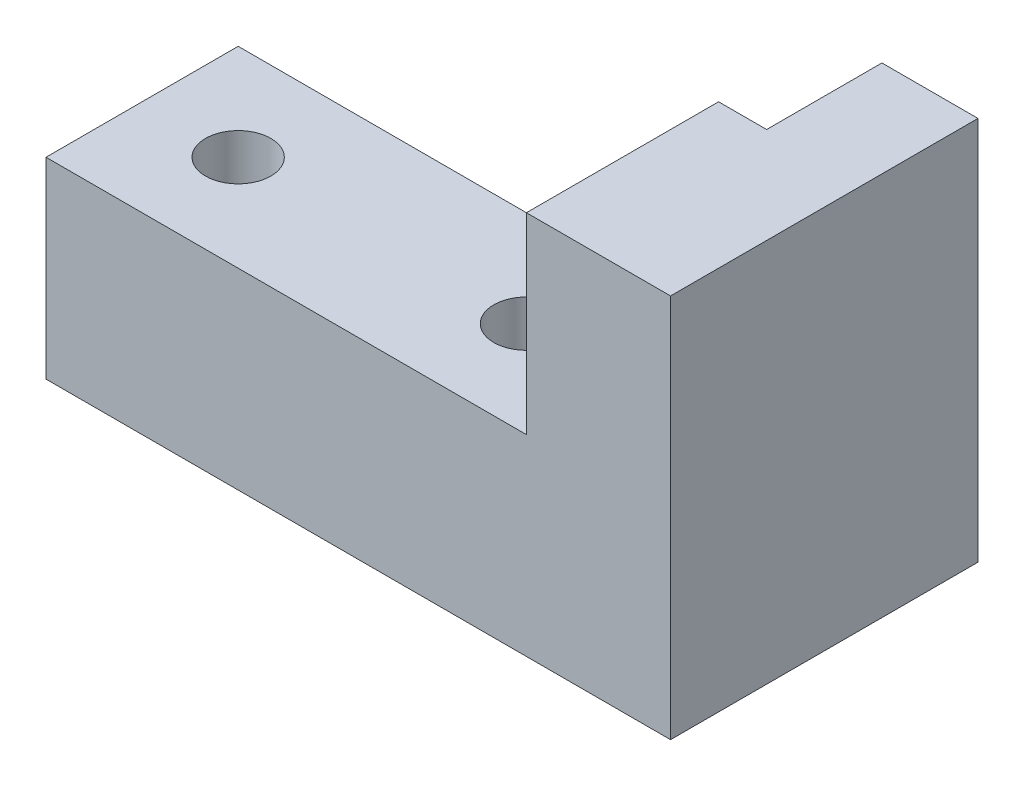
ISO-10303-21;
HEADER;
FILE_DESCRIPTION(('STEP AP214'),'2;1');
FILE_NAME('part.step','',(''),(''),'','','');
FILE_SCHEMA(('AUTOMOTIVE_DESIGN { 1 0 10303 214 1 1 1 1 }'));
ENDSEC;
DATA;
#1=APPLICATION_CONTEXT('core data for automotive mechanical design processes');
#2=APPLICATION_PROTOCOL_DEFINITION('international standard','automotive_design',2000,#1);
#3=PRODUCT_CONTEXT('',#1,'mechanical');
#4=PRODUCT('Part','Part','',(#3));
#5=PRODUCT_RELATED_PRODUCT_CATEGORY('part','',(#4));
#6=PRODUCT_DEFINITION_FORMATION('','',#4);
#7=PRODUCT_DEFINITION_CONTEXT('part definition',#1,'design');
#8=PRODUCT_DEFINITION('design','',#6,#7);
#9=PRODUCT_DEFINITION_SHAPE('','',#8);
#10=(LENGTH_UNIT() NAMED_UNIT(*) SI_UNIT(.MILLI.,.METRE.));
#11=(NAMED_UNIT(*) PLANE_ANGLE_UNIT() SI_UNIT($,.RADIAN.));
#12=(NAMED_UNIT(*) SI_UNIT($,.STERADIAN.) SOLID_ANGLE_UNIT());
#13=UNCERTAINTY_MEASURE_WITH_UNIT(LENGTH_MEASURE(1.E-05),#10,'distance_accuracy_value','');
#14=(GEOMETRIC_REPRESENTATION_CONTEXT(3) GLOBAL_UNCERTAINTY_ASSIGNED_CONTEXT((#13)) GLOBAL_UNIT_ASSIGNED_CONTEXT((#10,
#11,#12)) REPRESENTATION_CONTEXT('',''));
#15=CARTESIAN_POINT('',(0.,0.,0.));
#16=DIRECTION('',(0.,0.,1.));
#17=DIRECTION('',(1.,0.,0.));
#18=AXIS2_PLACEMENT_3D('',#15,#16,#17);
#19=CARTESIAN_POINT('',(0.,10.,0.));
#20=DIRECTION('',(0.,1.,0.));
#21=DIRECTION('',(0.,0.,1.));
#22=AXIS2_PLACEMENT_3D('',#19,#20,#21);
#23=PLANE('',#22);
#24=CARTESIAN_POINT('',(-7.5,10.,0.));
#25=DIRECTION('',(0.,1.,0.));
#26=DIRECTION('',(0.,0.,1.));
#27=AXIS2_PLACEMENT_3D('',#24,#25,#26);
#28=CIRCLE('',#27,1.7);
#29=CARTESIAN_POINT('',(-7.5,10.,1.7));
#30=VERTEX_POINT('',#29);
#31=EDGE_CURVE('E96',#30,#30,#28,.T.);
#32=ORIENTED_EDGE('',*,*,#31,.F.);
#33=EDGE_LOOP('',(#32));
#34=FACE_BOUND('',#33,.T.);
#35=DIRECTION('',(0.,0.,1.));
#36=VECTOR('',#35,1.);
#37=CARTESIAN_POINT('',(-12.5,10.,-5.));
#38=LINE('',#37,#36);
#39=CARTESIAN_POINT('',(-12.5,10.,-5.));
#40=VERTEX_POINT('',#39);
#41=CARTESIAN_POINT('',(-12.5,10.,5.));
#42=VERTEX_POINT('',#41);
#43=EDGE_CURVE('E86',#40,#42,#38,.T.);
#44=ORIENTED_EDGE('',*,*,#43,.T.);
#45=DIRECTION('',(1.,0.,0.));
#46=VECTOR('',#45,1.);
#47=CARTESIAN_POINT('',(-12.5,10.,5.));
#48=LINE('',#47,#46);
#49=CARTESIAN_POINT('',(12.5,10.,4.99999999999999));
#50=VERTEX_POINT('',#49);
#51=EDGE_CURVE('E80',#42,#50,#48,.T.);
#52=ORIENTED_EDGE('',*,*,#51,.T.);
#53=DIRECTION('',(0.,0.,-1.));
#54=VECTOR('',#53,1.);
#55=CARTESIAN_POINT('',(12.5,10.,-5.));
#56=LINE('',#55,#54);
#57=CARTESIAN_POINT('',(12.5,10.,-5.));
#58=VERTEX_POINT('',#57);
#59=EDGE_CURVE('E69',#50,#58,#56,.T.);
#60=ORIENTED_EDGE('',*,*,#59,.T.);
#61=DIRECTION('',(-1.,0.,0.));
#62=VECTOR('',#61,1.);
#63=CARTESIAN_POINT('',(-12.5,10.,-5.));
#64=LINE('',#63,#62);
#65=EDGE_CURVE('E49',#58,#40,#64,.T.);
#66=ORIENTED_EDGE('',*,*,#65,.T.);
#67=EDGE_LOOP('',(#44,#52,#60,#66));
#68=FACE_BOUND('',#67,.T.);
#69=CARTESIAN_POINT('',(7.5,10.,0.));
#70=DIRECTION('',(0.,1.,0.));
#71=DIRECTION('',(0.,0.,1.));
#72=AXIS2_PLACEMENT_3D('',#69,#70,#71);
#73=CIRCLE('',#72,1.7);
#74=CARTESIAN_POINT('',(7.5,10.,1.7));
#75=VERTEX_POINT('',#74);
#76=EDGE_CURVE('E107',#75,#75,#73,.T.);
#77=ORIENTED_EDGE('',*,*,#76,.F.);
#78=EDGE_LOOP('',(#77));
#79=FACE_BOUND('',#78,.T.);
#80=ADVANCED_FACE('F32',(#34,#68,#79),#23,.T.);
#81=CARTESIAN_POINT('',(0.,0.,0.));
#82=DIRECTION('',(0.,1.,0.));
#83=DIRECTION('',(0.,0.,1.));
#84=AXIS2_PLACEMENT_3D('',#81,#82,#83);
#85=PLANE('',#84);
#86=DIRECTION('',(0.,0.,1.));
#87=VECTOR('',#86,1.);
#88=CARTESIAN_POINT('',(-12.5,0.,-5.));
#89=LINE('',#88,#87);
#90=CARTESIAN_POINT('',(-12.5,0.,-5.));
#91=VERTEX_POINT('',#90);
#92=CARTESIAN_POINT('',(-12.5,0.,5.));
#93=VERTEX_POINT('',#92);
#94=EDGE_CURVE('E94',#91,#93,#89,.T.);
#95=ORIENTED_EDGE('',*,*,#94,.F.);
#96=DIRECTION('',(-1.,0.,0.));
#97=VECTOR('',#96,1.);
#98=CARTESIAN_POINT('',(-12.5,0.,-5.));
#99=LINE('',#98,#97);
#100=CARTESIAN_POINT('',(15.,0.,-5.));
#101=VERTEX_POINT('',#100);
#102=EDGE_CURVE('E92',#101,#91,#99,.T.);
#103=ORIENTED_EDGE('',*,*,#102,.F.);
#104=DIRECTION('',(0.,0.,1.));
#105=VECTOR('',#104,1.);
#106=CARTESIAN_POINT('',(15.,0.,-5.));
#107=LINE('',#106,#105);
#108=CARTESIAN_POINT('',(15.,0.,-11.));
#109=VERTEX_POINT('',#108);
#110=EDGE_CURVE('E130',#109,#101,#107,.T.);
#111=ORIENTED_EDGE('',*,*,#110,.F.);
#112=DIRECTION('',(-1.,0.,0.));
#113=VECTOR('',#112,1.);
#114=CARTESIAN_POINT('',(20.,0.,-11.));
#115=LINE('',#114,#113);
#116=CARTESIAN_POINT('',(20.,0.,-11.));
#117=VERTEX_POINT('',#116);
#118=EDGE_CURVE('E134',#117,#109,#115,.T.);
#119=ORIENTED_EDGE('',*,*,#118,.F.);
#120=DIRECTION('',(0.,0.,-1.));
#121=VECTOR('',#120,1.);
#122=CARTESIAN_POINT('',(20.,0.,4.99999999999999));
#123=LINE('',#122,#121);
#124=CARTESIAN_POINT('',(20.,0.,4.99999999999999));
#125=VERTEX_POINT('',#124);
#126=EDGE_CURVE('E137',#125,#117,#123,.T.);
#127=ORIENTED_EDGE('',*,*,#126,.F.);
#128=DIRECTION('',(1.,0.,0.));
#129=VECTOR('',#128,1.);
#130=CARTESIAN_POINT('',(-12.5,0.,5.));
#131=LINE('',#130,#129);
#132=EDGE_CURVE('E62',#93,#125,#131,.T.);
#133=ORIENTED_EDGE('',*,*,#132,.F.);
#134=EDGE_LOOP('',(#95,#103,#111,#119,#127,#133));
#135=FACE_BOUND('',#134,.T.);
#136=CARTESIAN_POINT('',(-7.5,0.,0.));
#137=DIRECTION('',(0.,1.,0.));
#138=DIRECTION('',(0.,0.,1.));
#139=AXIS2_PLACEMENT_3D('',#136,#137,#138);
#140=CIRCLE('',#139,1.7);
#141=CARTESIAN_POINT('',(-7.5,0.,1.7));
#142=VERTEX_POINT('',#141);
#143=EDGE_CURVE('E100',#142,#142,#140,.T.);
#144=ORIENTED_EDGE('',*,*,#143,.T.);
#145=EDGE_LOOP('',(#144));
#146=FACE_BOUND('',#145,.T.);
#147=CARTESIAN_POINT('',(7.5,0.,0.));
#148=DIRECTION('',(0.,1.,0.));
#149=DIRECTION('',(0.,0.,1.));
#150=AXIS2_PLACEMENT_3D('',#147,#148,#149);
#151=CIRCLE('',#150,1.7);
#152=CARTESIAN_POINT('',(7.5,0.,1.7));
#153=VERTEX_POINT('',#152);
#154=EDGE_CURVE('E109',#153,#153,#151,.T.);
#155=ORIENTED_EDGE('',*,*,#154,.T.);
#156=EDGE_LOOP('',(#155));
#157=FACE_BOUND('',#156,.T.);
#158=ADVANCED_FACE('F179',(#135,#146,#157),#85,.F.);
#159=CARTESIAN_POINT('',(-12.5,10.,-5.));
#160=DIRECTION('',(1.,0.,0.));
#161=DIRECTION('',(0.,0.,-1.));
#162=AXIS2_PLACEMENT_3D('',#159,#160,#161);
#163=PLANE('',#162);
#164=ORIENTED_EDGE('',*,*,#94,.T.);
#165=DIRECTION('',(0.,-1.,0.));
#166=VECTOR('',#165,1.);
#167=CARTESIAN_POINT('',(-12.5,10.,5.));
#168=LINE('',#167,#166);
#169=EDGE_CURVE('E11',#42,#93,#168,.T.);
#170=ORIENTED_EDGE('',*,*,#169,.F.);
#171=ORIENTED_EDGE('',*,*,#43,.F.);
#172=DIRECTION('',(0.,-1.,0.));
#173=VECTOR('',#172,1.);
#174=CARTESIAN_POINT('',(-12.5,10.,-5.));
#175=LINE('',#174,#173);
#176=EDGE_CURVE('E41',#40,#91,#175,.T.);
#177=ORIENTED_EDGE('',*,*,#176,.T.);
#178=EDGE_LOOP('',(#164,#170,#171,#177));
#179=FACE_BOUND('',#178,.T.);
#180=ADVANCED_FACE('F34',(#179),#163,.F.);
#181=CARTESIAN_POINT('',(-12.5,10.,5.));
#182=DIRECTION('',(0.,0.,-1.));
#183=DIRECTION('',(-1.,0.,0.));
#184=AXIS2_PLACEMENT_3D('',#181,#182,#183);
#185=PLANE('',#184);
#186=ORIENTED_EDGE('',*,*,#132,.T.);
#187=DIRECTION('',(0.,-1.,0.));
#188=VECTOR('',#187,1.);
#189=CARTESIAN_POINT('',(20.,20.,4.99999999999999));
#190=LINE('',#189,#188);
#191=CARTESIAN_POINT('',(20.,20.,4.99999999999999));
#192=VERTEX_POINT('',#191);
#193=EDGE_CURVE('E115',#192,#125,#190,.T.);
#194=ORIENTED_EDGE('',*,*,#193,.F.);
#195=DIRECTION('',(1.,0.,0.));
#196=VECTOR('',#195,1.);
#197=CARTESIAN_POINT('',(12.5,20.,4.99999999999999));
#198=LINE('',#197,#196);
#199=CARTESIAN_POINT('',(12.5,20.,4.99999999999999));
#200=VERTEX_POINT('',#199);
#201=EDGE_CURVE('E150',#200,#192,#198,.T.);
#202=ORIENTED_EDGE('',*,*,#201,.F.);
#203=DIRECTION('',(0.,-1.,0.));
#204=VECTOR('',#203,1.);
#205=CARTESIAN_POINT('',(12.5,20.,4.99999999999999));
#206=LINE('',#205,#204);
#207=EDGE_CURVE('E85',#200,#50,#206,.T.);
#208=ORIENTED_EDGE('',*,*,#207,.T.);
#209=ORIENTED_EDGE('',*,*,#51,.F.);
#210=ORIENTED_EDGE('',*,*,#169,.T.);
#211=EDGE_LOOP('',(#186,#194,#202,#208,#209,#210));
#212=FACE_BOUND('',#211,.T.);
#213=ADVANCED_FACE('F81',(#212),#185,.F.);
#214=CARTESIAN_POINT('',(-12.5,10.,-5.));
#215=DIRECTION('',(0.,0.,1.));
#216=DIRECTION('',(1.,0.,0.));
#217=AXIS2_PLACEMENT_3D('',#214,#215,#216);
#218=PLANE('',#217);
#219=ORIENTED_EDGE('',*,*,#102,.T.);
#220=ORIENTED_EDGE('',*,*,#176,.F.);
#221=ORIENTED_EDGE('',*,*,#65,.F.);
#222=DIRECTION('',(0.,-1.,0.));
#223=VECTOR('',#222,1.);
#224=CARTESIAN_POINT('',(12.5,20.,-5.));
#225=LINE('',#224,#223);
#226=CARTESIAN_POINT('',(12.5,20.,-5.));
#227=VERTEX_POINT('',#226);
#228=EDGE_CURVE('E127',#227,#58,#225,.T.);
#229=ORIENTED_EDGE('',*,*,#228,.F.);
#230=DIRECTION('',(-1.,0.,0.));
#231=VECTOR('',#230,1.);
#232=CARTESIAN_POINT('',(12.5,20.,-5.));
#233=LINE('',#232,#231);
#234=CARTESIAN_POINT('',(15.,20.,-5.));
#235=VERTEX_POINT('',#234);
#236=EDGE_CURVE('E129',#235,#227,#233,.T.);
#237=ORIENTED_EDGE('',*,*,#236,.F.);
#238=DIRECTION('',(0.,-1.,0.));
#239=VECTOR('',#238,1.);
#240=CARTESIAN_POINT('',(15.,20.,-5.));
#241=LINE('',#240,#239);
#242=EDGE_CURVE('E124',#235,#101,#241,.T.);
#243=ORIENTED_EDGE('',*,*,#242,.T.);
#244=EDGE_LOOP('',(#219,#220,#221,#229,#237,#243));
#245=FACE_BOUND('',#244,.T.);
#246=ADVANCED_FACE('F189',(#245),#218,.F.);
#247=CARTESIAN_POINT('',(-7.5,10.,0.));
#248=DIRECTION('',(0.,-1.,0.));
#249=DIRECTION('',(0.,0.,-1.));
#250=AXIS2_PLACEMENT_3D('',#247,#248,#249);
#251=CYLINDRICAL_SURFACE('',#250,1.7);
#252=ORIENTED_EDGE('',*,*,#31,.T.);
#253=EDGE_LOOP('',(#252));
#254=FACE_BOUND('',#253,.T.);
#255=ORIENTED_EDGE('',*,*,#143,.F.);
#256=EDGE_LOOP('',(#255));
#257=FACE_BOUND('',#256,.T.);
#258=ADVANCED_FACE('F175',(#254,#257),#251,.F.);
#259=CARTESIAN_POINT('',(7.5,10.,0.));
#260=DIRECTION('',(0.,-1.,0.));
#261=DIRECTION('',(0.,0.,-1.));
#262=AXIS2_PLACEMENT_3D('',#259,#260,#261);
#263=CYLINDRICAL_SURFACE('',#262,1.7);
#264=ORIENTED_EDGE('',*,*,#76,.T.);
#265=EDGE_LOOP('',(#264));
#266=FACE_BOUND('',#265,.T.);
#267=ORIENTED_EDGE('',*,*,#154,.F.);
#268=EDGE_LOOP('',(#267));
#269=FACE_BOUND('',#268,.T.);
#270=ADVANCED_FACE('F166',(#266,#269),#263,.F.);
#271=CARTESIAN_POINT('',(12.5,20.,4.99999999999999));
#272=DIRECTION('',(1.,0.,0.));
#273=DIRECTION('',(0.,0.,-1.));
#274=AXIS2_PLACEMENT_3D('',#271,#272,#273);
#275=PLANE('',#274);
#276=ORIENTED_EDGE('',*,*,#59,.F.);
#277=ORIENTED_EDGE('',*,*,#207,.F.);
#278=DIRECTION('',(0.,0.,1.));
#279=VECTOR('',#278,1.);
#280=CARTESIAN_POINT('',(12.5,20.,4.99999999999999));
#281=LINE('',#280,#279);
#282=EDGE_CURVE('E133',#227,#200,#281,.T.);
#283=ORIENTED_EDGE('',*,*,#282,.F.);
#284=ORIENTED_EDGE('',*,*,#228,.T.);
#285=EDGE_LOOP('',(#276,#277,#283,#284));
#286=FACE_BOUND('',#285,.T.);
#287=ADVANCED_FACE('F163',(#286),#275,.F.);
#288=CARTESIAN_POINT('',(20.,20.,4.99999999999999));
#289=DIRECTION('',(-1.,0.,0.));
#290=DIRECTION('',(0.,0.,1.));
#291=AXIS2_PLACEMENT_3D('',#288,#289,#290);
#292=PLANE('',#291);
#293=ORIENTED_EDGE('',*,*,#126,.T.);
#294=DIRECTION('',(0.,-1.,0.));
#295=VECTOR('',#294,1.);
#296=CARTESIAN_POINT('',(20.,20.,-11.));
#297=LINE('',#296,#295);
#298=CARTESIAN_POINT('',(20.,20.,-11.));
#299=VERTEX_POINT('',#298);
#300=EDGE_CURVE('E118',#299,#117,#297,.T.);
#301=ORIENTED_EDGE('',*,*,#300,.F.);
#302=DIRECTION('',(0.,0.,-1.));
#303=VECTOR('',#302,1.);
#304=CARTESIAN_POINT('',(20.,20.,4.99999999999999));
#305=LINE('',#304,#303);
#306=EDGE_CURVE('E147',#192,#299,#305,.T.);
#307=ORIENTED_EDGE('',*,*,#306,.F.);
#308=ORIENTED_EDGE('',*,*,#193,.T.);
#309=EDGE_LOOP('',(#293,#301,#307,#308));
#310=FACE_BOUND('',#309,.T.);
#311=ADVANCED_FACE('F165',(#310),#292,.F.);
#312=CARTESIAN_POINT('',(20.,20.,-11.));
#313=DIRECTION('',(0.,0.,1.));
#314=DIRECTION('',(1.,0.,0.));
#315=AXIS2_PLACEMENT_3D('',#312,#313,#314);
#316=PLANE('',#315);
#317=ORIENTED_EDGE('',*,*,#118,.T.);
#318=DIRECTION('',(0.,-1.,0.));
#319=VECTOR('',#318,1.);
#320=CARTESIAN_POINT('',(15.,20.,-11.));
#321=LINE('',#320,#319);
#322=CARTESIAN_POINT('',(15.,20.,-11.));
#323=VERTEX_POINT('',#322);
#324=EDGE_CURVE('E121',#323,#109,#321,.T.);
#325=ORIENTED_EDGE('',*,*,#324,.F.);
#326=DIRECTION('',(-1.,0.,0.));
#327=VECTOR('',#326,1.);
#328=CARTESIAN_POINT('',(20.,20.,-11.));
#329=LINE('',#328,#327);
#330=EDGE_CURVE('E144',#299,#323,#329,.T.);
#331=ORIENTED_EDGE('',*,*,#330,.F.);
#332=ORIENTED_EDGE('',*,*,#300,.T.);
#333=EDGE_LOOP('',(#317,#325,#331,#332));
#334=FACE_BOUND('',#333,.T.);
#335=ADVANCED_FACE('F172',(#334),#316,.F.);
#336=CARTESIAN_POINT('',(15.,20.,-5.));
#337=DIRECTION('',(1.,0.,0.));
#338=DIRECTION('',(0.,0.,-1.));
#339=AXIS2_PLACEMENT_3D('',#336,#337,#338);
#340=PLANE('',#339);
#341=ORIENTED_EDGE('',*,*,#110,.T.);
#342=ORIENTED_EDGE('',*,*,#242,.F.);
#343=DIRECTION('',(0.,0.,1.));
#344=VECTOR('',#343,1.);
#345=CARTESIAN_POINT('',(15.,20.,-5.));
#346=LINE('',#345,#344);
#347=EDGE_CURVE('E141',#323,#235,#346,.T.);
#348=ORIENTED_EDGE('',*,*,#347,.F.);
#349=ORIENTED_EDGE('',*,*,#324,.T.);
#350=EDGE_LOOP('',(#341,#342,#348,#349));
#351=FACE_BOUND('',#350,.T.);
#352=ADVANCED_FACE('F240',(#351),#340,.F.);
#353=CARTESIAN_POINT('',(0.,20.,0.));
#354=DIRECTION('',(0.,-1.,0.));
#355=DIRECTION('',(0.,0.,-1.));
#356=AXIS2_PLACEMENT_3D('',#353,#354,#355);
#357=PLANE('',#356);
#358=ORIENTED_EDGE('',*,*,#282,.T.);
#359=ORIENTED_EDGE('',*,*,#201,.T.);
#360=ORIENTED_EDGE('',*,*,#306,.T.);
#361=ORIENTED_EDGE('',*,*,#330,.T.);
#362=ORIENTED_EDGE('',*,*,#347,.T.);
#363=ORIENTED_EDGE('',*,*,#236,.T.);
#364=EDGE_LOOP('',(#358,#359,#360,#361,#362,#363));
#365=FACE_BOUND('',#364,.T.);
#366=ADVANCED_FACE('F157',(#365),#357,.F.);
#367=CLOSED_SHELL('',(#80,#158,#180,#213,#246,#258,#270,#287,#311,#335,#352,#366));
#368=MANIFOLD_SOLID_BREP('B2',#367);
#369=ADVANCED_BREP_SHAPE_REPRESENTATION('',(#18,#368),#14);
#370=SHAPE_DEFINITION_REPRESENTATION(#9,#369);
ENDSEC;
END-ISO-10303-21;
